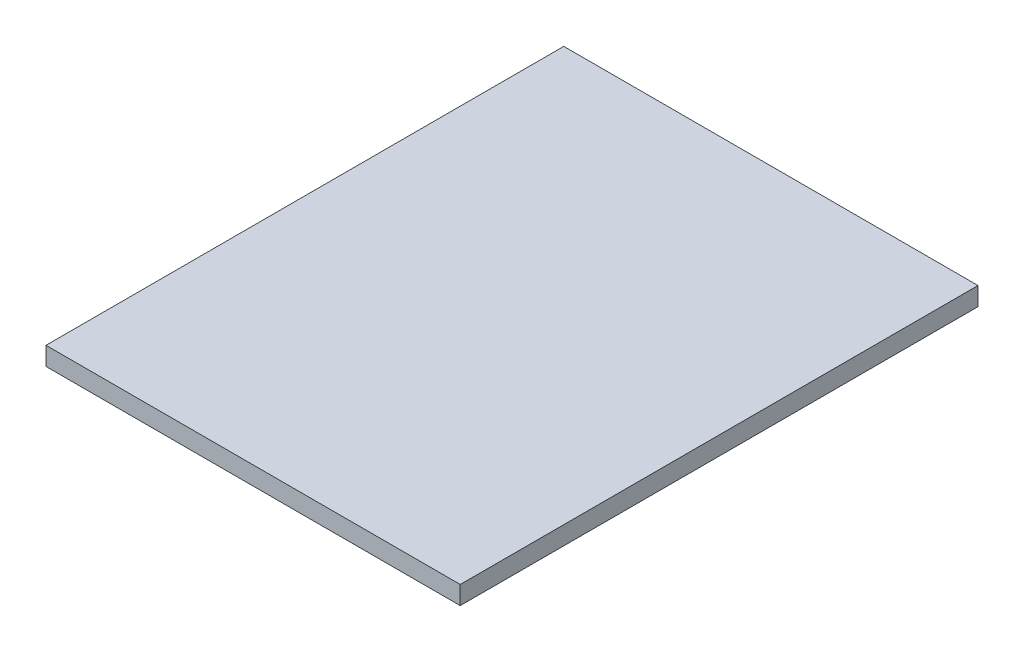
ISO-10303-21;
HEADER;
FILE_DESCRIPTION(('STEP AP214'),'2;1');
FILE_NAME('part.step','',(''),(''),'','','');
FILE_SCHEMA(('AUTOMOTIVE_DESIGN { 1 0 10303 214 1 1 1 1 }'));
ENDSEC;
DATA;
#1=APPLICATION_CONTEXT('core data for automotive mechanical design processes');
#2=APPLICATION_PROTOCOL_DEFINITION('international standard','automotive_design',2000,#1);
#3=PRODUCT_CONTEXT('',#1,'mechanical');
#4=PRODUCT('Part','Part','',(#3));
#5=PRODUCT_RELATED_PRODUCT_CATEGORY('part','',(#4));
#6=PRODUCT_DEFINITION_FORMATION('','',#4);
#7=PRODUCT_DEFINITION_CONTEXT('part definition',#1,'design');
#8=PRODUCT_DEFINITION('design','',#6,#7);
#9=PRODUCT_DEFINITION_SHAPE('','',#8);
#10=(LENGTH_UNIT() NAMED_UNIT(*) SI_UNIT(.MILLI.,.METRE.));
#11=(NAMED_UNIT(*) PLANE_ANGLE_UNIT() SI_UNIT($,.RADIAN.));
#12=(NAMED_UNIT(*) SI_UNIT($,.STERADIAN.) SOLID_ANGLE_UNIT());
#13=UNCERTAINTY_MEASURE_WITH_UNIT(LENGTH_MEASURE(1.E-05),#10,'distance_accuracy_value','');
#14=(GEOMETRIC_REPRESENTATION_CONTEXT(3) GLOBAL_UNCERTAINTY_ASSIGNED_CONTEXT((#13)) GLOBAL_UNIT_ASSIGNED_CONTEXT((#10,
#11,#12)) REPRESENTATION_CONTEXT('',''));
#15=CARTESIAN_POINT('',(0.,0.,0.));
#16=DIRECTION('',(0.,0.,1.));
#17=DIRECTION('',(1.,0.,0.));
#18=AXIS2_PLACEMENT_3D('',#15,#16,#17);
#19=CARTESIAN_POINT('',(3.429,2.9756,6.6802));
#20=DIRECTION('',(1.,0.,0.));
#21=DIRECTION('',(0.,-1.,0.));
#22=AXIS2_PLACEMENT_3D('',#19,#20,#21);
#23=PLANE('',#22);
#24=DIRECTION('',(0.,0.,1.));
#25=VECTOR('',#24,1.);
#26=CARTESIAN_POINT('',(3.429,2.9306,6.6802));
#27=LINE('',#26,#25);
#28=CARTESIAN_POINT('',(3.429,2.9306,5.4102));
#29=VERTEX_POINT('',#28);
#30=CARTESIAN_POINT('',(3.429,2.9306,6.6802));
#31=VERTEX_POINT('',#30);
#32=EDGE_CURVE('E11',#29,#31,#27,.T.);
#33=ORIENTED_EDGE('',*,*,#32,.T.);
#34=DIRECTION('',(0.,-1.,0.));
#35=VECTOR('',#34,1.);
#36=CARTESIAN_POINT('',(3.429,2.9756,6.6802));
#37=LINE('',#36,#35);
#38=CARTESIAN_POINT('',(3.429,2.9756,6.6802));
#39=VERTEX_POINT('',#38);
#40=EDGE_CURVE('E24',#39,#31,#37,.T.);
#41=ORIENTED_EDGE('',*,*,#40,.F.);
#42=DIRECTION('',(0.,0.,1.));
#43=VECTOR('',#42,1.);
#44=CARTESIAN_POINT('',(3.429,2.9756,6.6802));
#45=LINE('',#44,#43);
#46=CARTESIAN_POINT('',(3.429,2.9756,5.4102));
#47=VERTEX_POINT('',#46);
#48=EDGE_CURVE('E88',#47,#39,#45,.T.);
#49=ORIENTED_EDGE('',*,*,#48,.F.);
#50=DIRECTION('',(0.,-1.,0.));
#51=VECTOR('',#50,1.);
#52=CARTESIAN_POINT('',(3.429,2.9756,5.4102));
#53=LINE('',#52,#51);
#54=EDGE_CURVE('E77',#47,#29,#53,.T.);
#55=ORIENTED_EDGE('',*,*,#54,.T.);
#56=EDGE_LOOP('',(#33,#41,#49,#55));
#57=FACE_BOUND('',#56,.T.);
#58=ADVANCED_FACE('F17',(#57),#23,.F.);
#59=CARTESIAN_POINT('',(4.445,2.9756,6.6802));
#60=DIRECTION('',(0.,0.,-1.));
#61=DIRECTION('',(0.,1.,0.));
#62=AXIS2_PLACEMENT_3D('',#59,#60,#61);
#63=PLANE('',#62);
#64=DIRECTION('',(1.,0.,0.));
#65=VECTOR('',#64,1.);
#66=CARTESIAN_POINT('',(4.445,2.9306,6.6802));
#67=LINE('',#66,#65);
#68=CARTESIAN_POINT('',(4.445,2.9306,6.6802));
#69=VERTEX_POINT('',#68);
#70=EDGE_CURVE('E85',#31,#69,#67,.T.);
#71=ORIENTED_EDGE('',*,*,#70,.T.);
#72=DIRECTION('',(0.,-1.,0.));
#73=VECTOR('',#72,1.);
#74=CARTESIAN_POINT('',(4.445,2.9756,6.6802));
#75=LINE('',#74,#73);
#76=CARTESIAN_POINT('',(4.445,2.9756,6.6802));
#77=VERTEX_POINT('',#76);
#78=EDGE_CURVE('E83',#77,#69,#75,.T.);
#79=ORIENTED_EDGE('',*,*,#78,.F.);
#80=DIRECTION('',(1.,0.,0.));
#81=VECTOR('',#80,1.);
#82=CARTESIAN_POINT('',(4.445,2.9756,6.6802));
#83=LINE('',#82,#81);
#84=EDGE_CURVE('E72',#39,#77,#83,.T.);
#85=ORIENTED_EDGE('',*,*,#84,.F.);
#86=ORIENTED_EDGE('',*,*,#40,.T.);
#87=EDGE_LOOP('',(#71,#79,#85,#86));
#88=FACE_BOUND('',#87,.T.);
#89=ADVANCED_FACE('F90',(#88),#63,.F.);
#90=CARTESIAN_POINT('',(4.445,2.9756,5.4102));
#91=DIRECTION('',(-1.,0.,0.));
#92=DIRECTION('',(0.,1.,0.));
#93=AXIS2_PLACEMENT_3D('',#90,#91,#92);
#94=PLANE('',#93);
#95=DIRECTION('',(0.,0.,-1.));
#96=VECTOR('',#95,1.);
#97=CARTESIAN_POINT('',(4.445,2.9306,5.4102));
#98=LINE('',#97,#96);
#99=CARTESIAN_POINT('',(4.445,2.9306,5.4102));
#100=VERTEX_POINT('',#99);
#101=EDGE_CURVE('E60',#69,#100,#98,.T.);
#102=ORIENTED_EDGE('',*,*,#101,.T.);
#103=DIRECTION('',(0.,-1.,0.));
#104=VECTOR('',#103,1.);
#105=CARTESIAN_POINT('',(4.445,2.9756,5.4102));
#106=LINE('',#105,#104);
#107=CARTESIAN_POINT('',(4.445,2.9756,5.4102));
#108=VERTEX_POINT('',#107);
#109=EDGE_CURVE('E54',#108,#100,#106,.T.);
#110=ORIENTED_EDGE('',*,*,#109,.F.);
#111=DIRECTION('',(0.,0.,-1.));
#112=VECTOR('',#111,1.);
#113=CARTESIAN_POINT('',(4.445,2.9756,5.4102));
#114=LINE('',#113,#112);
#115=EDGE_CURVE('E58',#77,#108,#114,.T.);
#116=ORIENTED_EDGE('',*,*,#115,.F.);
#117=ORIENTED_EDGE('',*,*,#78,.T.);
#118=EDGE_LOOP('',(#102,#110,#116,#117));
#119=FACE_BOUND('',#118,.T.);
#120=ADVANCED_FACE('F56',(#119),#94,.F.);
#121=CARTESIAN_POINT('',(3.429,2.9756,5.4102));
#122=DIRECTION('',(0.,0.,1.));
#123=DIRECTION('',(0.,-1.,0.));
#124=AXIS2_PLACEMENT_3D('',#121,#122,#123);
#125=PLANE('',#124);
#126=DIRECTION('',(-1.,0.,0.));
#127=VECTOR('',#126,1.);
#128=CARTESIAN_POINT('',(3.429,2.9306,5.4102));
#129=LINE('',#128,#127);
#130=EDGE_CURVE('E73',#100,#29,#129,.T.);
#131=ORIENTED_EDGE('',*,*,#130,.T.);
#132=ORIENTED_EDGE('',*,*,#54,.F.);
#133=DIRECTION('',(-1.,0.,0.));
#134=VECTOR('',#133,1.);
#135=CARTESIAN_POINT('',(3.429,2.9756,5.4102));
#136=LINE('',#135,#134);
#137=EDGE_CURVE('E70',#108,#47,#136,.T.);
#138=ORIENTED_EDGE('',*,*,#137,.F.);
#139=ORIENTED_EDGE('',*,*,#109,.T.);
#140=EDGE_LOOP('',(#131,#132,#138,#139));
#141=FACE_BOUND('',#140,.T.);
#142=ADVANCED_FACE('F76',(#141),#125,.F.);
#143=CARTESIAN_POINT('',(0.,2.9756,0.));
#144=DIRECTION('',(0.,-1.,0.));
#145=DIRECTION('',(-1.,0.,0.));
#146=AXIS2_PLACEMENT_3D('',#143,#144,#145);
#147=PLANE('',#146);
#148=ORIENTED_EDGE('',*,*,#48,.T.);
#149=ORIENTED_EDGE('',*,*,#84,.T.);
#150=ORIENTED_EDGE('',*,*,#115,.T.);
#151=ORIENTED_EDGE('',*,*,#137,.T.);
#152=EDGE_LOOP('',(#148,#149,#150,#151));
#153=FACE_BOUND('',#152,.T.);
#154=ADVANCED_FACE('F69',(#153),#147,.F.);
#155=CARTESIAN_POINT('',(0.,2.9306,0.));
#156=DIRECTION('',(0.,-1.,0.));
#157=DIRECTION('',(-1.,0.,0.));
#158=AXIS2_PLACEMENT_3D('',#155,#156,#157);
#159=PLANE('',#158);
#160=ORIENTED_EDGE('',*,*,#32,.F.);
#161=ORIENTED_EDGE('',*,*,#130,.F.);
#162=ORIENTED_EDGE('',*,*,#101,.F.);
#163=ORIENTED_EDGE('',*,*,#70,.F.);
#164=EDGE_LOOP('',(#160,#161,#162,#163));
#165=FACE_BOUND('',#164,.T.);
#166=ADVANCED_FACE('F91',(#165),#159,.T.);
#167=CLOSED_SHELL('',(#58,#89,#120,#142,#154,#166));
#168=MANIFOLD_SOLID_BREP('B1',#167);
#169=ADVANCED_BREP_SHAPE_REPRESENTATION('',(#18,#168),#14);
#170=SHAPE_DEFINITION_REPRESENTATION(#9,#169);
ENDSEC;
END-ISO-10303-21;
